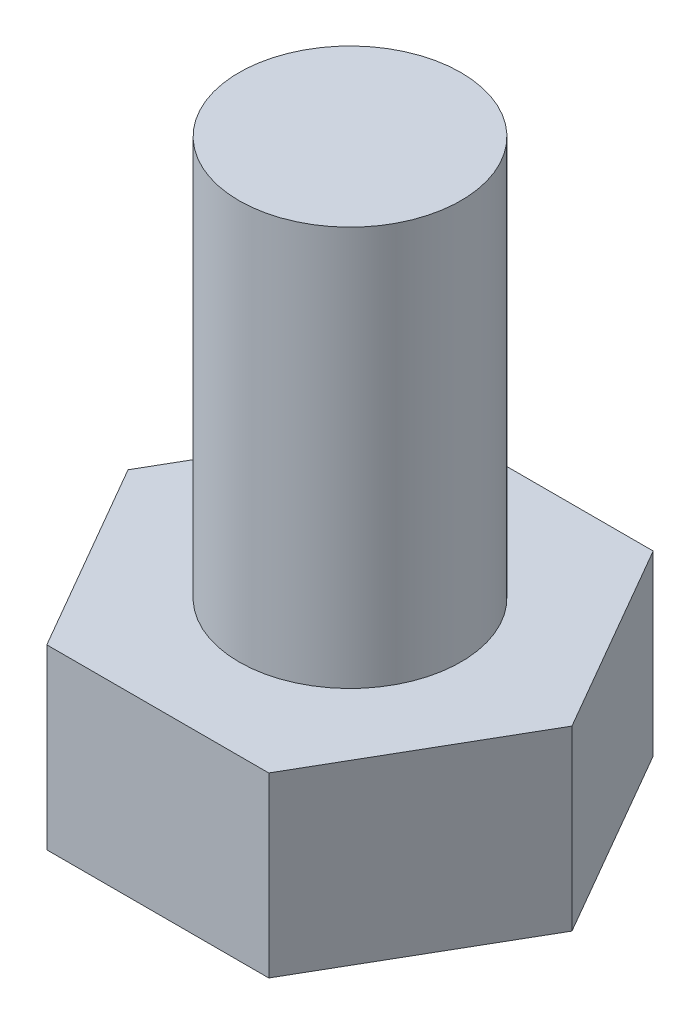
ISO-10303-21;
HEADER;
FILE_DESCRIPTION(('STEP AP214'),'2;1');
FILE_NAME('part.step','',(''),(''),'','','');
FILE_SCHEMA(('AUTOMOTIVE_DESIGN { 1 0 10303 214 1 1 1 1 }'));
ENDSEC;
DATA;
#1=APPLICATION_CONTEXT('core data for automotive mechanical design processes');
#2=APPLICATION_PROTOCOL_DEFINITION('international standard','automotive_design',2000,#1);
#3=PRODUCT_CONTEXT('',#1,'mechanical');
#4=PRODUCT('Part','Part','',(#3));
#5=PRODUCT_RELATED_PRODUCT_CATEGORY('part','',(#4));
#6=PRODUCT_DEFINITION_FORMATION('','',#4);
#7=PRODUCT_DEFINITION_CONTEXT('part definition',#1,'design');
#8=PRODUCT_DEFINITION('design','',#6,#7);
#9=PRODUCT_DEFINITION_SHAPE('','',#8);
#10=(LENGTH_UNIT() NAMED_UNIT(*) SI_UNIT(.MILLI.,.METRE.));
#11=(NAMED_UNIT(*) PLANE_ANGLE_UNIT() SI_UNIT($,.RADIAN.));
#12=(NAMED_UNIT(*) SI_UNIT($,.STERADIAN.) SOLID_ANGLE_UNIT());
#13=UNCERTAINTY_MEASURE_WITH_UNIT(LENGTH_MEASURE(1.E-05),#10,'distance_accuracy_value','');
#14=(GEOMETRIC_REPRESENTATION_CONTEXT(3) GLOBAL_UNCERTAINTY_ASSIGNED_CONTEXT((#13)) GLOBAL_UNIT_ASSIGNED_CONTEXT((#10,
#11,#12)) REPRESENTATION_CONTEXT('',''));
#15=CARTESIAN_POINT('',(0.,0.,0.));
#16=DIRECTION('',(0.,0.,1.));
#17=DIRECTION('',(1.,0.,0.));
#18=AXIS2_PLACEMENT_3D('',#15,#16,#17);
#19=CARTESIAN_POINT('',(0.,13.,0.));
#20=DIRECTION('',(0.,-1.,0.));
#21=DIRECTION('',(0.,0.,-1.));
#22=AXIS2_PLACEMENT_3D('',#19,#20,#21);
#23=CYLINDRICAL_SURFACE('',#22,2.5);
#24=CARTESIAN_POINT('',(0.,4.,0.));
#25=DIRECTION('',(0.,1.,0.));
#26=DIRECTION('',(0.,0.,1.));
#27=AXIS2_PLACEMENT_3D('',#24,#25,#26);
#28=CIRCLE('',#27,2.5);
#29=CARTESIAN_POINT('',(0.,4.,-2.5));
#30=VERTEX_POINT('',#29);
#31=EDGE_CURVE('E131',#30,#30,#28,.T.);
#32=CARTESIAN_POINT('',(0.,13.,0.));
#33=DIRECTION('',(0.,1.,0.));
#34=DIRECTION('',(0.,0.,1.));
#35=AXIS2_PLACEMENT_3D('',#32,#33,#34);
#36=CIRCLE('',#35,2.5);
#37=CARTESIAN_POINT('',(0.,13.,-2.5));
#38=VERTEX_POINT('',#37);
#39=EDGE_CURVE('E11',#38,#38,#36,.T.);
#40=CARTESIAN_POINT('',(0.,4.,-2.5));
#41=CARTESIAN_POINT('',(0.,4.09375,-2.5));
#42=CARTESIAN_POINT('',(0.,4.1875,-2.5));
#43=CARTESIAN_POINT('',(0.,4.375,-2.5));
#44=CARTESIAN_POINT('',(0.,4.46875,-2.5));
#45=CARTESIAN_POINT('',(0.,4.65625,-2.5));
#46=CARTESIAN_POINT('',(0.,4.75,-2.5));
#47=CARTESIAN_POINT('',(0.,4.9375,-2.5));
#48=CARTESIAN_POINT('',(0.,5.03125,-2.5));
#49=CARTESIAN_POINT('',(0.,5.21875,-2.5));
#50=CARTESIAN_POINT('',(0.,5.3125,-2.5));
#51=CARTESIAN_POINT('',(0.,5.5,-2.5));
#52=CARTESIAN_POINT('',(0.,5.59375,-2.5));
#53=CARTESIAN_POINT('',(0.,5.78125,-2.5));
#54=CARTESIAN_POINT('',(0.,5.875,-2.5));
#55=CARTESIAN_POINT('',(0.,6.0625,-2.5));
#56=CARTESIAN_POINT('',(0.,6.15625,-2.5));
#57=CARTESIAN_POINT('',(0.,6.34375,-2.5));
#58=CARTESIAN_POINT('',(0.,6.4375,-2.5));
#59=CARTESIAN_POINT('',(0.,6.625,-2.5));
#60=CARTESIAN_POINT('',(0.,6.71875,-2.5));
#61=CARTESIAN_POINT('',(0.,6.90625,-2.5));
#62=CARTESIAN_POINT('',(0.,7.,-2.5));
#63=CARTESIAN_POINT('',(0.,7.1875,-2.5));
#64=CARTESIAN_POINT('',(0.,7.28125,-2.5));
#65=CARTESIAN_POINT('',(0.,7.46875,-2.5));
#66=CARTESIAN_POINT('',(0.,7.5625,-2.5));
#67=CARTESIAN_POINT('',(0.,7.75,-2.5));
#68=CARTESIAN_POINT('',(0.,7.84375,-2.5));
#69=CARTESIAN_POINT('',(0.,8.03125,-2.5));
#70=CARTESIAN_POINT('',(0.,8.125,-2.5));
#71=CARTESIAN_POINT('',(0.,8.3125,-2.5));
#72=CARTESIAN_POINT('',(0.,8.40625,-2.5));
#73=CARTESIAN_POINT('',(0.,8.59375,-2.5));
#74=CARTESIAN_POINT('',(0.,8.6875,-2.5));
#75=CARTESIAN_POINT('',(0.,8.875,-2.5));
#76=CARTESIAN_POINT('',(0.,8.96875,-2.5));
#77=CARTESIAN_POINT('',(0.,9.15625,-2.5));
#78=CARTESIAN_POINT('',(0.,9.25,-2.5));
#79=CARTESIAN_POINT('',(0.,9.4375,-2.5));
#80=CARTESIAN_POINT('',(0.,9.53125,-2.5));
#81=CARTESIAN_POINT('',(0.,9.71875,-2.5));
#82=CARTESIAN_POINT('',(0.,9.8125,-2.5));
#83=CARTESIAN_POINT('',(0.,10.,-2.5));
#84=CARTESIAN_POINT('',(0.,10.09375,-2.5));
#85=CARTESIAN_POINT('',(0.,10.28125,-2.5));
#86=CARTESIAN_POINT('',(0.,10.375,-2.5));
#87=CARTESIAN_POINT('',(0.,10.5625,-2.5));
#88=CARTESIAN_POINT('',(0.,10.65625,-2.5));
#89=CARTESIAN_POINT('',(0.,10.84375,-2.5));
#90=CARTESIAN_POINT('',(0.,10.9375,-2.5));
#91=CARTESIAN_POINT('',(0.,11.125,-2.5));
#92=CARTESIAN_POINT('',(0.,11.21875,-2.5));
#93=CARTESIAN_POINT('',(0.,11.40625,-2.5));
#94=CARTESIAN_POINT('',(0.,11.5,-2.5));
#95=CARTESIAN_POINT('',(0.,11.6875,-2.5));
#96=CARTESIAN_POINT('',(0.,11.78125,-2.5));
#97=CARTESIAN_POINT('',(0.,11.96875,-2.5));
#98=CARTESIAN_POINT('',(0.,12.0625,-2.5));
#99=CARTESIAN_POINT('',(0.,12.25,-2.5));
#100=CARTESIAN_POINT('',(0.,12.34375,-2.5));
#101=CARTESIAN_POINT('',(0.,12.53125,-2.5));
#102=CARTESIAN_POINT('',(0.,12.625,-2.5));
#103=CARTESIAN_POINT('',(0.,12.8125,-2.5));
#104=CARTESIAN_POINT('',(0.,12.90625,-2.5));
#105=CARTESIAN_POINT('',(0.,13.,-2.5));
#106=B_SPLINE_CURVE_WITH_KNOTS('',3,(#40,#41,#42,#43,#44,#45,#46,#47,#48,#49,#50,#51,#52,#53,
#54,#55,#56,#57,#58,#59,#60,#61,#62,#63,#64,#65,#66,#67,#68,#69,#70,#71,#72,#73,#74,#75,#76,#77,
#78,#79,#80,#81,#82,#83,#84,#85,#86,#87,#88,#89,#90,#91,#92,#93,#94,#95,#96,#97,#98,#99,#100,
#101,#102,#103,#104,#105),.UNSPECIFIED.,.F.,.F.,(4,2,2,2,2,2,2,2,2,2,2,2,2,2,2,2,2,2,2,2,2,2,2,
2,2,2,2,2,2,2,2,2,4),(0.,0.28125,0.5625,0.843750000000001,1.125,1.40625,1.6875,1.96875,2.25,
2.53125,2.8125,3.09375,3.375,3.65625,3.9375,4.21875,4.5,4.78125,5.0625,5.34375,5.625,5.90625,
6.1875,6.46875,6.75,7.03125,7.3125,7.59375,7.875,8.15625,8.4375,8.71875,9.),.UNSPECIFIED.);
#107=EDGE_CURVE('BSEAM41',#30,#38,#106,.T.);
#108=ORIENTED_EDGE('',*,*,#31,.T.);
#109=ORIENTED_EDGE('',*,*,#39,.F.);
#110=ORIENTED_EDGE('',*,*,#107,.T.);
#111=ORIENTED_EDGE('',*,*,#107,.F.);
#112=EDGE_LOOP('',(#108,#110,#109,#111));
#113=FACE_BOUND('',#112,.T.);
#114=ADVANCED_FACE('F41',(#113),#23,.T.);
#115=CARTESIAN_POINT('',(0.,13.,0.));
#116=DIRECTION('',(0.,1.,0.));
#117=DIRECTION('',(0.,0.,1.));
#118=AXIS2_PLACEMENT_3D('',#115,#116,#117);
#119=PLANE('',#118);
#120=ORIENTED_EDGE('',*,*,#39,.T.);
#121=EDGE_LOOP('',(#120));
#122=FACE_BOUND('',#121,.T.);
#123=ADVANCED_FACE('F163',(#122),#119,.T.);
#124=CARTESIAN_POINT('',(0.,4.,0.));
#125=DIRECTION('',(0.,1.,0.));
#126=DIRECTION('',(0.,0.,1.));
#127=AXIS2_PLACEMENT_3D('',#124,#125,#126);
#128=PLANE('',#127);
#129=DIRECTION('',(1.,0.,0.));
#130=VECTOR('',#129,1.);
#131=CARTESIAN_POINT('',(-2.5,4.,4.33012701892219));
#132=LINE('',#131,#130);
#133=CARTESIAN_POINT('',(-2.5,4.,4.33012701892219));
#134=VERTEX_POINT('',#133);
#135=CARTESIAN_POINT('',(2.5,4.,4.3301270189222));
#136=VERTEX_POINT('',#135);
#137=EDGE_CURVE('E138',#134,#136,#132,.T.);
#138=ORIENTED_EDGE('',*,*,#137,.T.);
#139=DIRECTION('',(0.5,0.,-0.866025403784439));
#140=VECTOR('',#139,1.);
#141=CARTESIAN_POINT('',(2.5,4.,4.3301270189222));
#142=LINE('',#141,#140);
#143=CARTESIAN_POINT('',(5.,4.,0.));
#144=VERTEX_POINT('',#143);
#145=EDGE_CURVE('E95',#136,#144,#142,.T.);
#146=ORIENTED_EDGE('',*,*,#145,.T.);
#147=DIRECTION('',(-0.5,0.,-0.866025403784438));
#148=VECTOR('',#147,1.);
#149=CARTESIAN_POINT('',(5.,4.,0.));
#150=LINE('',#149,#148);
#151=CARTESIAN_POINT('',(2.5,4.,-4.3301270189222));
#152=VERTEX_POINT('',#151);
#153=EDGE_CURVE('E109',#144,#152,#150,.T.);
#154=ORIENTED_EDGE('',*,*,#153,.T.);
#155=DIRECTION('',(-1.,0.,0.));
#156=VECTOR('',#155,1.);
#157=CARTESIAN_POINT('',(2.5,4.,-4.3301270189222));
#158=LINE('',#157,#156);
#159=CARTESIAN_POINT('',(-2.5,4.,-4.3301270189222));
#160=VERTEX_POINT('',#159);
#161=EDGE_CURVE('E102',#152,#160,#158,.T.);
#162=ORIENTED_EDGE('',*,*,#161,.T.);
#163=DIRECTION('',(-0.5,0.,0.866025403784439));
#164=VECTOR('',#163,1.);
#165=CARTESIAN_POINT('',(-2.5,4.,-4.3301270189222));
#166=LINE('',#165,#164);
#167=CARTESIAN_POINT('',(-5.,4.,0.));
#168=VERTEX_POINT('',#167);
#169=EDGE_CURVE('E107',#160,#168,#166,.T.);
#170=ORIENTED_EDGE('',*,*,#169,.T.);
#171=DIRECTION('',(0.5,0.,0.866025403784439));
#172=VECTOR('',#171,1.);
#173=CARTESIAN_POINT('',(-5.,4.,0.));
#174=LINE('',#173,#172);
#175=EDGE_CURVE('E57',#168,#134,#174,.T.);
#176=ORIENTED_EDGE('',*,*,#175,.T.);
#177=EDGE_LOOP('',(#138,#146,#154,#162,#170,#176));
#178=FACE_BOUND('',#177,.T.);
#179=ORIENTED_EDGE('',*,*,#31,.F.);
#180=EDGE_LOOP('',(#179));
#181=FACE_BOUND('',#180,.T.);
#182=ADVANCED_FACE('F104',(#178,#181),#128,.T.);
#183=CARTESIAN_POINT('',(-2.5,4.,4.33012701892219));
#184=DIRECTION('',(0.,0.,-1.));
#185=DIRECTION('',(-1.,0.,0.));
#186=AXIS2_PLACEMENT_3D('',#183,#184,#185);
#187=PLANE('',#186);
#188=DIRECTION('',(1.,0.,0.));
#189=VECTOR('',#188,1.);
#190=CARTESIAN_POINT('',(-2.5,0.,4.33012701892219));
#191=LINE('',#190,#189);
#192=CARTESIAN_POINT('',(-2.5,0.,4.33012701892219));
#193=VERTEX_POINT('',#192);
#194=CARTESIAN_POINT('',(2.5,0.,4.3301270189222));
#195=VERTEX_POINT('',#194);
#196=EDGE_CURVE('E127',#193,#195,#191,.T.);
#197=ORIENTED_EDGE('',*,*,#196,.T.);
#198=DIRECTION('',(0.,-1.,0.));
#199=VECTOR('',#198,1.);
#200=CARTESIAN_POINT('',(2.5,4.,4.3301270189222));
#201=LINE('',#200,#199);
#202=EDGE_CURVE('E49',#136,#195,#201,.T.);
#203=ORIENTED_EDGE('',*,*,#202,.F.);
#204=ORIENTED_EDGE('',*,*,#137,.F.);
#205=DIRECTION('',(0.,-1.,0.));
#206=VECTOR('',#205,1.);
#207=CARTESIAN_POINT('',(-2.5,4.,4.33012701892219));
#208=LINE('',#207,#206);
#209=EDGE_CURVE('E123',#134,#193,#208,.T.);
#210=ORIENTED_EDGE('',*,*,#209,.T.);
#211=EDGE_LOOP('',(#197,#203,#204,#210));
#212=FACE_BOUND('',#211,.T.);
#213=ADVANCED_FACE('F149',(#212),#187,.F.);
#214=CARTESIAN_POINT('',(2.5,4.,4.3301270189222));
#215=DIRECTION('',(-0.866025403784439,0.,-0.5));
#216=DIRECTION('',(-0.5,0.,0.866025403784439));
#217=AXIS2_PLACEMENT_3D('',#214,#215,#216);
#218=PLANE('',#217);
#219=DIRECTION('',(0.5,0.,-0.866025403784439));
#220=VECTOR('',#219,1.);
#221=CARTESIAN_POINT('',(2.5,0.,4.3301270189222));
#222=LINE('',#221,#220);
#223=CARTESIAN_POINT('',(5.,0.,0.));
#224=VERTEX_POINT('',#223);
#225=EDGE_CURVE('E130',#195,#224,#222,.T.);
#226=ORIENTED_EDGE('',*,*,#225,.T.);
#227=DIRECTION('',(0.,-1.,0.));
#228=VECTOR('',#227,1.);
#229=CARTESIAN_POINT('',(5.,4.,0.));
#230=LINE('',#229,#228);
#231=EDGE_CURVE('E142',#144,#224,#230,.T.);
#232=ORIENTED_EDGE('',*,*,#231,.F.);
#233=ORIENTED_EDGE('',*,*,#145,.F.);
#234=ORIENTED_EDGE('',*,*,#202,.T.);
#235=EDGE_LOOP('',(#226,#232,#233,#234));
#236=FACE_BOUND('',#235,.T.);
#237=ADVANCED_FACE('F145',(#236),#218,.F.);
#238=CARTESIAN_POINT('',(5.,4.,0.));
#239=DIRECTION('',(-0.866025403784438,0.,0.5));
#240=DIRECTION('',(0.5,0.,0.866025403784439));
#241=AXIS2_PLACEMENT_3D('',#238,#239,#240);
#242=PLANE('',#241);
#243=DIRECTION('',(-0.5,0.,-0.866025403784438));
#244=VECTOR('',#243,1.);
#245=CARTESIAN_POINT('',(5.,0.,0.));
#246=LINE('',#245,#244);
#247=CARTESIAN_POINT('',(2.5,0.,-4.3301270189222));
#248=VERTEX_POINT('',#247);
#249=EDGE_CURVE('E133',#224,#248,#246,.T.);
#250=ORIENTED_EDGE('',*,*,#249,.T.);
#251=DIRECTION('',(0.,-1.,0.));
#252=VECTOR('',#251,1.);
#253=CARTESIAN_POINT('',(2.5,4.,-4.3301270189222));
#254=LINE('',#253,#252);
#255=EDGE_CURVE('E118',#152,#248,#254,.T.);
#256=ORIENTED_EDGE('',*,*,#255,.F.);
#257=ORIENTED_EDGE('',*,*,#153,.F.);
#258=ORIENTED_EDGE('',*,*,#231,.T.);
#259=EDGE_LOOP('',(#250,#256,#257,#258));
#260=FACE_BOUND('',#259,.T.);
#261=ADVANCED_FACE('F154',(#260),#242,.F.);
#262=CARTESIAN_POINT('',(2.5,4.,-4.3301270189222));
#263=DIRECTION('',(0.,0.,1.));
#264=DIRECTION('',(1.,0.,0.));
#265=AXIS2_PLACEMENT_3D('',#262,#263,#264);
#266=PLANE('',#265);
#267=DIRECTION('',(-1.,0.,0.));
#268=VECTOR('',#267,1.);
#269=CARTESIAN_POINT('',(2.5,0.,-4.3301270189222));
#270=LINE('',#269,#268);
#271=CARTESIAN_POINT('',(-2.5,0.,-4.3301270189222));
#272=VERTEX_POINT('',#271);
#273=EDGE_CURVE('E117',#248,#272,#270,.T.);
#274=ORIENTED_EDGE('',*,*,#273,.T.);
#275=DIRECTION('',(0.,-1.,0.));
#276=VECTOR('',#275,1.);
#277=CARTESIAN_POINT('',(-2.5,4.,-4.3301270189222));
#278=LINE('',#277,#276);
#279=EDGE_CURVE('E114',#160,#272,#278,.T.);
#280=ORIENTED_EDGE('',*,*,#279,.F.);
#281=ORIENTED_EDGE('',*,*,#161,.F.);
#282=ORIENTED_EDGE('',*,*,#255,.T.);
#283=EDGE_LOOP('',(#274,#280,#281,#282));
#284=FACE_BOUND('',#283,.T.);
#285=ADVANCED_FACE('F115',(#284),#266,.F.);
#286=CARTESIAN_POINT('',(-2.5,4.,-4.3301270189222));
#287=DIRECTION('',(0.866025403784439,0.,0.5));
#288=DIRECTION('',(0.5,0.,-0.866025403784439));
#289=AXIS2_PLACEMENT_3D('',#286,#287,#288);
#290=PLANE('',#289);
#291=DIRECTION('',(-0.5,0.,0.866025403784439));
#292=VECTOR('',#291,1.);
#293=CARTESIAN_POINT('',(-2.5,0.,-4.3301270189222));
#294=LINE('',#293,#292);
#295=CARTESIAN_POINT('',(-5.,0.,0.));
#296=VERTEX_POINT('',#295);
#297=EDGE_CURVE('E80',#272,#296,#294,.T.);
#298=ORIENTED_EDGE('',*,*,#297,.T.);
#299=DIRECTION('',(0.,-1.,0.));
#300=VECTOR('',#299,1.);
#301=CARTESIAN_POINT('',(-5.,4.,0.));
#302=LINE('',#301,#300);
#303=EDGE_CURVE('E119',#168,#296,#302,.T.);
#304=ORIENTED_EDGE('',*,*,#303,.F.);
#305=ORIENTED_EDGE('',*,*,#169,.F.);
#306=ORIENTED_EDGE('',*,*,#279,.T.);
#307=EDGE_LOOP('',(#298,#304,#305,#306));
#308=FACE_BOUND('',#307,.T.);
#309=ADVANCED_FACE('F121',(#308),#290,.F.);
#310=CARTESIAN_POINT('',(-5.,4.,0.));
#311=DIRECTION('',(0.866025403784439,0.,-0.5));
#312=DIRECTION('',(-0.5,0.,-0.866025403784439));
#313=AXIS2_PLACEMENT_3D('',#310,#311,#312);
#314=PLANE('',#313);
#315=DIRECTION('',(0.5,0.,0.866025403784439));
#316=VECTOR('',#315,1.);
#317=CARTESIAN_POINT('',(-5.,0.,0.));
#318=LINE('',#317,#316);
#319=EDGE_CURVE('E86',#296,#193,#318,.T.);
#320=ORIENTED_EDGE('',*,*,#319,.T.);
#321=ORIENTED_EDGE('',*,*,#209,.F.);
#322=ORIENTED_EDGE('',*,*,#175,.F.);
#323=ORIENTED_EDGE('',*,*,#303,.T.);
#324=EDGE_LOOP('',(#320,#321,#322,#323));
#325=FACE_BOUND('',#324,.T.);
#326=ADVANCED_FACE('F196',(#325),#314,.F.);
#327=CARTESIAN_POINT('',(0.,0.,0.));
#328=DIRECTION('',(0.,1.,0.));
#329=DIRECTION('',(0.,0.,1.));
#330=AXIS2_PLACEMENT_3D('',#327,#328,#329);
#331=PLANE('',#330);
#332=ORIENTED_EDGE('',*,*,#196,.F.);
#333=ORIENTED_EDGE('',*,*,#319,.F.);
#334=ORIENTED_EDGE('',*,*,#297,.F.);
#335=ORIENTED_EDGE('',*,*,#273,.F.);
#336=ORIENTED_EDGE('',*,*,#249,.F.);
#337=ORIENTED_EDGE('',*,*,#225,.F.);
#338=EDGE_LOOP('',(#332,#333,#334,#335,#336,#337));
#339=FACE_BOUND('',#338,.T.);
#340=ADVANCED_FACE('F151',(#339),#331,.F.);
#341=CLOSED_SHELL('',(#114,#123,#182,#213,#237,#261,#285,#309,#326,#340));
#342=MANIFOLD_SOLID_BREP('B2',#341);
#343=ADVANCED_BREP_SHAPE_REPRESENTATION('',(#18,#342),#14);
#344=SHAPE_DEFINITION_REPRESENTATION(#9,#343);
ENDSEC;
END-ISO-10303-21;
